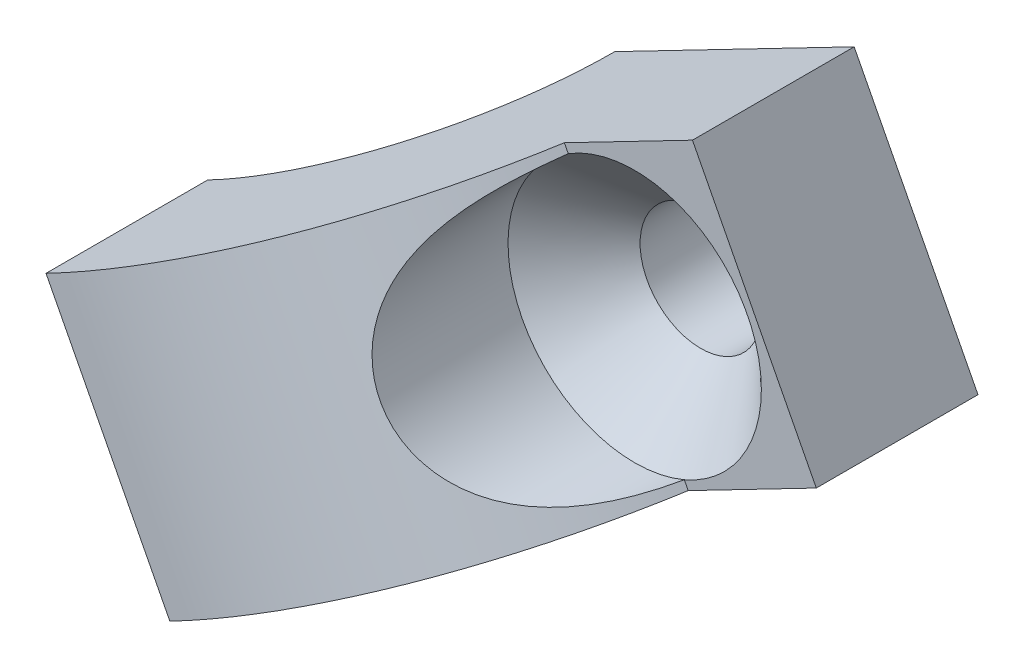
ISO-10303-21;
HEADER;
FILE_DESCRIPTION(('STEP AP214'),'2;1');
FILE_NAME('part.step','',(''),(''),'','','');
FILE_SCHEMA(('AUTOMOTIVE_DESIGN { 1 0 10303 214 1 1 1 1 }'));
ENDSEC;
DATA;
#1=APPLICATION_CONTEXT('core data for automotive mechanical design processes');
#2=APPLICATION_PROTOCOL_DEFINITION('international standard','automotive_design',2000,#1);
#3=PRODUCT_CONTEXT('',#1,'mechanical');
#4=PRODUCT('Part','Part','',(#3));
#5=PRODUCT_RELATED_PRODUCT_CATEGORY('part','',(#4));
#6=PRODUCT_DEFINITION_FORMATION('','',#4);
#7=PRODUCT_DEFINITION_CONTEXT('part definition',#1,'design');
#8=PRODUCT_DEFINITION('design','',#6,#7);
#9=PRODUCT_DEFINITION_SHAPE('','',#8);
#10=(LENGTH_UNIT() NAMED_UNIT(*) SI_UNIT(.MILLI.,.METRE.));
#11=(NAMED_UNIT(*) PLANE_ANGLE_UNIT() SI_UNIT($,.RADIAN.));
#12=(NAMED_UNIT(*) SI_UNIT($,.STERADIAN.) SOLID_ANGLE_UNIT());
#13=UNCERTAINTY_MEASURE_WITH_UNIT(LENGTH_MEASURE(1.E-05),#10,'distance_accuracy_value','');
#14=(GEOMETRIC_REPRESENTATION_CONTEXT(3) GLOBAL_UNCERTAINTY_ASSIGNED_CONTEXT((#13)) GLOBAL_UNIT_ASSIGNED_CONTEXT((#10,
#11,#12)) REPRESENTATION_CONTEXT('',''));
#15=CARTESIAN_POINT('',(0.,0.,0.));
#16=DIRECTION('',(0.,0.,1.));
#17=DIRECTION('',(1.,0.,0.));
#18=AXIS2_PLACEMENT_3D('',#15,#16,#17);
#19=CARTESIAN_POINT('',(-88.8437319794772,-54.5333247798695,27.9506255766667));
#20=DIRECTION('',(0.459545783688733,-0.888154081617547,0.));
#21=DIRECTION('',(0.888154081617547,0.459545783688733,0.));
#22=AXIS2_PLACEMENT_3D('',#19,#20,#21);
#23=CYLINDRICAL_SURFACE('',#22,14.);
#24=CARTESIAN_POINT('',(-73.1578062795977,-57.323924409204,33.9506255766667));
#25=CARTESIAN_POINT('',(-73.2135602395387,-57.3476724599156,34.0780271360485));
#26=CARTESIAN_POINT('',(-73.2716062671052,-57.3711348309346,34.204469152727));
#27=CARTESIAN_POINT('',(-73.3924399454088,-57.4170056057904,34.4553032040038));
#28=CARTESIAN_POINT('',(-73.4552288908372,-57.4394137191141,34.5796946674844));
#29=CARTESIAN_POINT('',(-73.6514285207596,-57.5044885696041,34.9504938764289));
#30=CARTESIAN_POINT('',(-73.7922215242245,-57.5448048916802,35.1934886847409));
#31=CARTESIAN_POINT('',(-74.0961207278185,-57.6149388973741,35.6714880758219));
#32=CARTESIAN_POINT('',(-74.2595034017159,-57.6446069348579,35.9063397924173));
#33=CARTESIAN_POINT('',(-74.6068896251844,-57.6867882175965,36.3614798057225));
#34=CARTESIAN_POINT('',(-74.7908497712302,-57.6993368607288,36.5817972540315));
#35=CARTESIAN_POINT('',(-75.085656588281,-57.7003074920455,36.9037548556136));
#36=CARTESIAN_POINT('',(-75.1894973929733,-57.6973856479032,37.0118533680927));
#37=CARTESIAN_POINT('',(-75.4020763418752,-57.683981017815,37.2226869017059));
#38=CARTESIAN_POINT('',(-75.5108146309852,-57.673498008021,37.3254217639528));
#39=CARTESIAN_POINT('',(-75.7321448813478,-57.6439615090948,37.5245030997131));
#40=CARTESIAN_POINT('',(-75.8447205520374,-57.6249408803691,37.6208724571251));
#41=CARTESIAN_POINT('',(-76.0732855444778,-57.5773008364498,37.8069983374078));
#42=CARTESIAN_POINT('',(-76.1892748150608,-57.5486815650672,37.8967549593288));
#43=CARTESIAN_POINT('',(-76.4251144779565,-57.4804363905553,38.0701097686517));
#44=CARTESIAN_POINT('',(-76.5449955079169,-57.4406716845336,38.1536122693272));
#45=CARTESIAN_POINT('',(-76.7857232072597,-57.349454187552,38.3124376740574));
#46=CARTESIAN_POINT('',(-76.9065696795239,-57.2980037265053,38.3877622042221));
#47=CARTESIAN_POINT('',(-77.1476035059059,-57.1827792433736,38.5296118392848));
#48=CARTESIAN_POINT('',(-77.2677907816245,-57.1190037867955,38.5961359183879));
#49=CARTESIAN_POINT('',(-77.5056042006024,-56.97881692934,38.71979084358));
#50=CARTESIAN_POINT('',(-77.6232309144309,-56.9024083767937,38.7769238012683));
#51=CARTESIAN_POINT('',(-77.8370713870962,-56.7490963930384,38.8737035525514));
#52=CARTESIAN_POINT('',(-77.9339039069313,-56.6738942903819,38.9146854923472));
#53=CARTESIAN_POINT('',(-78.1229790199715,-56.5145804583218,38.9892315194929));
#54=CARTESIAN_POINT('',(-78.2152224232026,-56.4304703095389,39.0227969195634));
#55=CARTESIAN_POINT('',(-78.3938394849096,-56.2538621701295,39.0823220049869));
#56=CARTESIAN_POINT('',(-78.4802168045268,-56.1613694969515,39.1082864683731));
#57=CARTESIAN_POINT('',(-78.6460089593225,-55.9686310221539,39.1525153550461));
#58=CARTESIAN_POINT('',(-78.7254246528427,-55.8683861792236,39.1707807286618));
#59=CARTESIAN_POINT('',(-78.8657867918916,-55.675423268883,39.197540068034));
#60=CARTESIAN_POINT('',(-78.9277666582483,-55.5835924977365,39.2070385887484));
#61=CARTESIAN_POINT('',(-79.0452412107903,-55.3954782509973,39.2202455221582));
#62=CARTESIAN_POINT('',(-79.1007364507407,-55.2991951565994,39.2239544296017));
#63=CARTESIAN_POINT('',(-79.2047576712576,-55.1029369847884,39.225572048529));
#64=CARTESIAN_POINT('',(-79.2532862991718,-55.0029633280604,39.223482969446));
#65=CARTESIAN_POINT('',(-79.3430459910153,-54.8000711388732,39.2135151732615));
#66=CARTESIAN_POINT('',(-79.3842770531613,-54.6971526056944,39.2056364547453));
#67=CARTESIAN_POINT('',(-79.4576968843154,-54.4933828460244,39.1845451211102));
#68=CARTESIAN_POINT('',(-79.4901824634142,-54.3926147702895,39.1715595994419));
#69=CARTESIAN_POINT('',(-79.5481187918902,-54.1898473145003,39.140307345525));
#70=CARTESIAN_POINT('',(-79.5735672407711,-54.0878475431405,39.1220388902247));
#71=CARTESIAN_POINT('',(-79.617405815662,-53.8834500695527,39.0802864911729));
#72=CARTESIAN_POINT('',(-79.6357989346844,-53.7810525547191,39.0568047656844));
#73=CARTESIAN_POINT('',(-79.6656520278747,-53.5765224871061,39.004690438722));
#74=CARTESIAN_POINT('',(-79.6771094037437,-53.4743900478798,38.9760559120877));
#75=CARTESIAN_POINT('',(-79.6934731908901,-53.268703190007,38.912994860817));
#76=CARTESIAN_POINT('',(-79.6982163890116,-53.165173174144,38.8784462011189));
#77=CARTESIAN_POINT('',(-79.7009518563425,-52.9598720512146,38.8041989274549));
#78=CARTESIAN_POINT('',(-79.6989416877101,-52.8581015926439,38.7644984587528));
#79=CARTESIAN_POINT('',(-79.6833446548942,-52.5564610182486,38.6379138322664));
#80=CARTESIAN_POINT('',(-79.6602007298819,-52.3601298177295,38.5435061702367));
#81=CARTESIAN_POINT('',(-79.5893090779863,-51.9644949200524,38.327129031997));
#82=CARTESIAN_POINT('',(-79.5395358141487,-51.7665118607047,38.203444387542));
#83=CARTESIAN_POINT('',(-79.4202408365403,-51.3905315147944,37.9369689512831));
#84=CARTESIAN_POINT('',(-79.3507195986424,-51.2125337467845,37.7941786199185));
#85=CARTESIAN_POINT('',(-79.2157987768513,-50.9175006084865,37.5279876549599));
#86=CARTESIAN_POINT('',(-79.1533069759273,-50.7959986663452,37.4079780242692));
#87=CARTESIAN_POINT('',(-79.0224381566121,-50.565338645716,37.1595052282328));
#88=CARTESIAN_POINT('',(-78.9540584362902,-50.4561862881159,37.0310381882681));
#89=CARTESIAN_POINT('',(-78.8131572119887,-50.2494429742986,36.7661450709101));
#90=CARTESIAN_POINT('',(-78.7406174183743,-50.1519099717619,36.6296837798473));
#91=CARTESIAN_POINT('',(-78.5934545299068,-49.9683460999754,36.3502864391111));
#92=CARTESIAN_POINT('',(-78.5188309250626,-49.882318076808,36.2073487989941));
#93=CARTESIAN_POINT('',(-78.3590553034694,-49.7102724039257,35.8964750520034));
#94=CARTESIAN_POINT('',(-78.2738221967583,-49.625775848912,35.7277414163063));
#95=CARTESIAN_POINT('',(-78.1043927757407,-49.4692713077764,35.3840202069455));
#96=CARTESIAN_POINT('',(-78.020196894348,-49.3972683823981,35.2090301334657));
#97=CARTESIAN_POINT('',(-77.8553791099386,-49.2653200930206,34.8559207716682));
#98=CARTESIAN_POINT('',(-77.7747257241218,-49.205235513263,34.6778677555682));
#99=CARTESIAN_POINT('',(-77.6170963541748,-49.0948778088556,34.3173994726159));
#100=CARTESIAN_POINT('',(-77.5401163544238,-49.0445937759973,34.1349893122506));
#101=CARTESIAN_POINT('',(-77.4654813537778,-48.9985750420414,33.9506255766668));
#102=B_SPLINE_CURVE_WITH_KNOTS('',3,(#24,#25,#26,#27,#28,#29,#30,#31,#32,#33,#34,#35,#36,#37,
#38,#39,#40,#41,#42,#43,#44,#45,#46,#47,#48,#49,#50,#51,#52,#53,#54,#55,#56,#57,#58,#59,#60,#61,
#62,#63,#64,#65,#66,#67,#68,#69,#70,#71,#72,#73,#74,#75,#76,#77,#78,#79,#80,#81,#82,#83,#84,#85,
#86,#87,#88,#89,#90,#91,#92,#93,#94,#95,#96,#97,#98,#99,#100,#101),.UNSPECIFIED.,.F.,.F.,(4,2,2,
2,2,2,2,2,2,2,2,2,2,2,2,2,2,2,2,2,2,2,2,2,2,2,2,2,2,2,2,2,2,2,2,2,2,2,4),(0.,0.423195212599889,
0.84650636671774,1.69656664790161,2.55814432224936,3.41793779315506,3.86740222850686,
4.31687997078522,4.76464236023326,5.21239804140911,5.66599869222485,6.11950898313133,
6.57307208944386,7.02653307189454,7.41378176107833,7.80096185260966,8.18789803323298,
8.57478643881442,8.90796041086726,9.24110591016703,9.57412447546414,9.90714312214067,
10.2267778523459,10.5465169506046,10.8661202587179,11.1858432240617,11.513212096257,
11.8406991553245,12.4952631566718,13.208695023705,13.9221097004126,14.4669488469125,
15.0120393630651,15.5597438963675,16.1075836702449,16.7282374289688,17.3491420094339,
17.9623006128006,18.5747728112573),.UNSPECIFIED.);
#103=CARTESIAN_POINT('',(-73.1578062795971,-57.3239244092051,33.9506255766667));
#104=VERTEX_POINT('',#103);
#105=CARTESIAN_POINT('',(-77.4654813537777,-48.9985750420417,33.9506255766667));
#106=VERTEX_POINT('',#105);
#107=EDGE_CURVE('E49',#104,#106,#102,.T.);
#108=ORIENTED_EDGE('',*,*,#107,.T.);
#109=DIRECTION('',(0.459545783688733,-0.888154081617547,0.));
#110=VECTOR('',#109,1.);
#111=CARTESIAN_POINT('',(-77.6093727351311,-48.7204793175357,33.9506255766667));
#112=LINE('',#111,#110);
#113=CARTESIAN_POINT('',(-77.6093727351311,-48.7204793175357,33.9506255766667));
#114=VERTEX_POINT('',#113);
#115=EDGE_CURVE('E146',#114,#106,#112,.T.);
#116=ORIENTED_EDGE('',*,*,#115,.F.);
#117=CARTESIAN_POINT('',(-88.8437319794772,-54.5333247798695,27.9506255766667));
#118=DIRECTION('',(-0.459545783688733,0.888154081617547,0.));
#119=DIRECTION('',(-0.888154081617547,-0.459545783688733,0.));
#120=AXIS2_PLACEMENT_3D('',#117,#118,#119);
#121=CIRCLE('',#120,14.);
#122=CARTESIAN_POINT('',(-88.8437319794772,-54.5333247798695,41.9506255766667));
#123=VERTEX_POINT('',#122);
#124=EDGE_CURVE('E108',#123,#114,#121,.T.);
#125=ORIENTED_EDGE('',*,*,#124,.F.);
#126=DIRECTION('',(0.459545783688733,-0.888154081617547,0.));
#127=VECTOR('',#126,1.);
#128=CARTESIAN_POINT('',(-88.8437319794772,-54.5333247798695,41.9506255766667));
#129=LINE('',#128,#127);
#130=CARTESIAN_POINT('',(-84.2482741425898,-63.4148655960449,41.9506255766667));
#131=VERTEX_POINT('',#130);
#132=EDGE_CURVE('E43',#123,#131,#129,.T.);
#133=ORIENTED_EDGE('',*,*,#132,.T.);
#134=CARTESIAN_POINT('',(-84.2482741425898,-63.4148655960449,27.9506255766667));
#135=DIRECTION('',(-0.459545783688733,0.888154081617547,0.));
#136=DIRECTION('',(-0.888154081617547,-0.459545783688733,0.));
#137=AXIS2_PLACEMENT_3D('',#134,#135,#136);
#138=CIRCLE('',#137,14.);
#139=CARTESIAN_POINT('',(-73.0139148982437,-57.6020201337111,33.9506255766667));
#140=VERTEX_POINT('',#139);
#141=EDGE_CURVE('E136',#131,#140,#138,.T.);
#142=ORIENTED_EDGE('',*,*,#141,.T.);
#143=EDGE_CURVE('E121',#104,#140,#112,.T.);
#144=ORIENTED_EDGE('',*,*,#143,.F.);
#145=EDGE_LOOP('',(#108,#116,#125,#133,#142,#144));
#146=FACE_BOUND('',#145,.T.);
#147=ADVANCED_FACE('F35',(#146),#23,.T.);
#148=CARTESIAN_POINT('',(-72.8569585103614,-46.2615006734723,33.9506255766667));
#149=DIRECTION('',(0.,0.,-1.));
#150=DIRECTION('',(-1.,0.,0.));
#151=AXIS2_PLACEMENT_3D('',#148,#149,#150);
#152=PLANE('',#151);
#153=CARTESIAN_POINT('',(-75.0000000000054,-53.0000000000037,33.9506255766667));
#154=DIRECTION('',(0.,0.,1.));
#155=DIRECTION('',(1.,0.,0.));
#156=AXIS2_PLACEMENT_3D('',#153,#154,#155);
#157=CIRCLE('',#156,4.7);
#158=EDGE_CURVE('E162',#104,#106,#157,.T.);
#159=ORIENTED_EDGE('',*,*,#158,.F.);
#160=ORIENTED_EDGE('',*,*,#143,.T.);
#161=DIRECTION('',(0.888154081617547,0.459545783688734,0.));
#162=VECTOR('',#161,1.);
#163=CARTESIAN_POINT('',(-68.261500673474,-55.1430414896477,33.9506255766667));
#164=LINE('',#163,#162);
#165=CARTESIAN_POINT('',(-68.261500673474,-55.1430414896477,33.9506255766667));
#166=VERTEX_POINT('',#165);
#167=EDGE_CURVE('E118',#140,#166,#164,.T.);
#168=ORIENTED_EDGE('',*,*,#167,.T.);
#169=DIRECTION('',(0.459545783688733,-0.888154081617547,0.));
#170=VECTOR('',#169,1.);
#171=CARTESIAN_POINT('',(-72.8569585103614,-46.2615006734723,33.9506255766667));
#172=LINE('',#171,#170);
#173=CARTESIAN_POINT('',(-72.8569585103614,-46.2615006734723,33.9506255766667));
#174=VERTEX_POINT('',#173);
#175=EDGE_CURVE('E114',#174,#166,#172,.T.);
#176=ORIENTED_EDGE('',*,*,#175,.F.);
#177=DIRECTION('',(0.888154081617547,0.459545783688734,0.));
#178=VECTOR('',#177,1.);
#179=CARTESIAN_POINT('',(-72.8569585103614,-46.2615006734723,33.9506255766667));
#180=LINE('',#179,#178);
#181=EDGE_CURVE('E101',#114,#174,#180,.T.);
#182=ORIENTED_EDGE('',*,*,#181,.F.);
#183=ORIENTED_EDGE('',*,*,#115,.T.);
#184=EDGE_LOOP('',(#159,#160,#168,#176,#182,#183));
#185=FACE_BOUND('',#184,.T.);
#186=ADVANCED_FACE('F116',(#185),#152,.F.);
#187=CARTESIAN_POINT('',(-88.8437319794772,-54.5333247798695,27.9506255766667));
#188=DIRECTION('',(0.459545783688733,-0.888154081617547,0.));
#189=DIRECTION('',(0.888154081617547,0.459545783688733,0.));
#190=AXIS2_PLACEMENT_3D('',#187,#188,#189);
#191=CYLINDRICAL_SURFACE('',#190,8.);
#192=CARTESIAN_POINT('',(-84.2482741425898,-63.4148655960449,27.9506255766667));
#193=DIRECTION('',(0.459545783688733,-0.888154081617547,0.));
#194=DIRECTION('',(-0.888154081617547,-0.459545783688733,0.));
#195=AXIS2_PLACEMENT_3D('',#192,#193,#194);
#196=CIRCLE('',#195,8.);
#197=CARTESIAN_POINT('',(-77.1430414896495,-59.7384993265351,27.9506255766667));
#198=VERTEX_POINT('',#197);
#199=CARTESIAN_POINT('',(-84.2482741425898,-63.4148655960449,35.9506255766667));
#200=VERTEX_POINT('',#199);
#201=EDGE_CURVE('E130',#198,#200,#196,.T.);
#202=ORIENTED_EDGE('',*,*,#201,.T.);
#203=DIRECTION('',(0.459545783688733,-0.888154081617547,0.));
#204=VECTOR('',#203,1.);
#205=CARTESIAN_POINT('',(-88.8437319794772,-54.5333247798695,35.9506255766667));
#206=LINE('',#205,#204);
#207=CARTESIAN_POINT('',(-88.8437319794772,-54.5333247798695,35.9506255766667));
#208=VERTEX_POINT('',#207);
#209=EDGE_CURVE('E11',#208,#200,#206,.T.);
#210=ORIENTED_EDGE('',*,*,#209,.F.);
#211=CARTESIAN_POINT('',(-88.8437319794772,-54.5333247798695,27.9506255766667));
#212=DIRECTION('',(0.459545783688733,-0.888154081617547,0.));
#213=DIRECTION('',(-0.888154081617547,-0.459545783688733,0.));
#214=AXIS2_PLACEMENT_3D('',#211,#212,#213);
#215=CIRCLE('',#214,8.);
#216=CARTESIAN_POINT('',(-81.7384993265368,-50.8569585103596,27.9506255766667));
#217=VERTEX_POINT('',#216);
#218=EDGE_CURVE('E143',#217,#208,#215,.T.);
#219=ORIENTED_EDGE('',*,*,#218,.F.);
#220=DIRECTION('',(0.459545783688733,-0.888154081617547,0.));
#221=VECTOR('',#220,1.);
#222=CARTESIAN_POINT('',(-81.7384993265368,-50.8569585103596,27.9506255766667));
#223=LINE('',#222,#221);
#224=EDGE_CURVE('E126',#217,#198,#223,.T.);
#225=ORIENTED_EDGE('',*,*,#224,.T.);
#226=EDGE_LOOP('',(#202,#210,#219,#225));
#227=FACE_BOUND('',#226,.T.);
#228=ADVANCED_FACE('F37',(#227),#191,.F.);
#229=CARTESIAN_POINT('',(-88.8437319794772,-54.5333247798695,35.9506255766667));
#230=DIRECTION('',(0.888154081617547,0.459545783688733,0.));
#231=DIRECTION('',(-0.459545783688733,0.888154081617547,0.));
#232=AXIS2_PLACEMENT_3D('',#229,#230,#231);
#233=PLANE('',#232);
#234=DIRECTION('',(0.,0.,1.));
#235=VECTOR('',#234,1.);
#236=CARTESIAN_POINT('',(-84.2482741425898,-63.4148655960449,35.9506255766667));
#237=LINE('',#236,#235);
#238=EDGE_CURVE('E133',#200,#131,#237,.T.);
#239=ORIENTED_EDGE('',*,*,#238,.T.);
#240=ORIENTED_EDGE('',*,*,#132,.F.);
#241=DIRECTION('',(0.,0.,1.));
#242=VECTOR('',#241,1.);
#243=CARTESIAN_POINT('',(-88.8437319794772,-54.5333247798695,35.9506255766667));
#244=LINE('',#243,#242);
#245=EDGE_CURVE('E93',#208,#123,#244,.T.);
#246=ORIENTED_EDGE('',*,*,#245,.F.);
#247=ORIENTED_EDGE('',*,*,#209,.T.);
#248=EDGE_LOOP('',(#239,#240,#246,#247));
#249=FACE_BOUND('',#248,.T.);
#250=ADVANCED_FACE('F197',(#249),#233,.F.);
#251=CARTESIAN_POINT('',(-72.8569585103614,-46.2615006734723,27.9506255766667));
#252=DIRECTION('',(-0.888154081617547,-0.459545783688733,0.));
#253=DIRECTION('',(0.459545783688733,-0.888154081617547,0.));
#254=AXIS2_PLACEMENT_3D('',#251,#252,#253);
#255=PLANE('',#254);
#256=DIRECTION('',(0.,0.,-1.));
#257=VECTOR('',#256,1.);
#258=CARTESIAN_POINT('',(-68.261500673474,-55.1430414896477,27.9506255766667));
#259=LINE('',#258,#257);
#260=CARTESIAN_POINT('',(-68.261500673474,-55.1430414896477,27.9506255766667));
#261=VERTEX_POINT('',#260);
#262=EDGE_CURVE('E140',#166,#261,#259,.T.);
#263=ORIENTED_EDGE('',*,*,#262,.T.);
#264=DIRECTION('',(0.459545783688733,-0.888154081617547,0.));
#265=VECTOR('',#264,1.);
#266=CARTESIAN_POINT('',(-72.8569585103614,-46.2615006734723,27.9506255766667));
#267=LINE('',#266,#265);
#268=CARTESIAN_POINT('',(-72.8569585103614,-46.2615006734723,27.9506255766667));
#269=VERTEX_POINT('',#268);
#270=EDGE_CURVE('E122',#269,#261,#267,.T.);
#271=ORIENTED_EDGE('',*,*,#270,.F.);
#272=DIRECTION('',(0.,0.,-1.));
#273=VECTOR('',#272,1.);
#274=CARTESIAN_POINT('',(-72.8569585103614,-46.2615006734723,27.9506255766667));
#275=LINE('',#274,#273);
#276=EDGE_CURVE('E105',#174,#269,#275,.T.);
#277=ORIENTED_EDGE('',*,*,#276,.F.);
#278=ORIENTED_EDGE('',*,*,#175,.T.);
#279=EDGE_LOOP('',(#263,#271,#277,#278));
#280=FACE_BOUND('',#279,.T.);
#281=ADVANCED_FACE('F124',(#280),#255,.F.);
#282=CARTESIAN_POINT('',(-81.7384993265368,-50.8569585103596,27.9506255766667));
#283=DIRECTION('',(0.,0.,1.));
#284=DIRECTION('',(1.,0.,0.));
#285=AXIS2_PLACEMENT_3D('',#282,#283,#284);
#286=PLANE('',#285);
#287=CARTESIAN_POINT('',(-75.0000000000054,-53.0000000000037,27.9506255766667));
#288=DIRECTION('',(0.,0.,1.));
#289=DIRECTION('',(1.,0.,0.));
#290=AXIS2_PLACEMENT_3D('',#287,#288,#289);
#291=CIRCLE('',#290,2.25);
#292=CARTESIAN_POINT('',(-72.7500000000054,-53.0000000000037,27.9506255766667));
#293=VERTEX_POINT('',#292);
#294=EDGE_CURVE('E166',#293,#293,#291,.T.);
#295=ORIENTED_EDGE('',*,*,#294,.T.);
#296=EDGE_LOOP('',(#295));
#297=FACE_BOUND('',#296,.T.);
#298=DIRECTION('',(-0.888154081617547,-0.459545783688733,0.));
#299=VECTOR('',#298,1.);
#300=CARTESIAN_POINT('',(-77.1430414896495,-59.7384993265351,27.9506255766667));
#301=LINE('',#300,#299);
#302=EDGE_CURVE('E85',#261,#198,#301,.T.);
#303=ORIENTED_EDGE('',*,*,#302,.T.);
#304=ORIENTED_EDGE('',*,*,#224,.F.);
#305=DIRECTION('',(-0.888154081617547,-0.459545783688733,0.));
#306=VECTOR('',#305,1.);
#307=CARTESIAN_POINT('',(-81.7384993265368,-50.8569585103596,27.9506255766667));
#308=LINE('',#307,#306);
#309=EDGE_CURVE('E58',#269,#217,#308,.T.);
#310=ORIENTED_EDGE('',*,*,#309,.F.);
#311=ORIENTED_EDGE('',*,*,#270,.T.);
#312=EDGE_LOOP('',(#303,#304,#310,#311));
#313=FACE_BOUND('',#312,.T.);
#314=ADVANCED_FACE('F154',(#297,#313),#286,.F.);
#315=CARTESIAN_POINT('',(-88.8437319794772,-54.5333247798695,27.9506255766667));
#316=DIRECTION('',(-0.459545783688733,0.888154081617547,0.));
#317=DIRECTION('',(-0.888154081617547,-0.459545783688733,0.));
#318=AXIS2_PLACEMENT_3D('',#315,#316,#317);
#319=PLANE('',#318);
#320=ORIENTED_EDGE('',*,*,#218,.T.);
#321=ORIENTED_EDGE('',*,*,#245,.T.);
#322=ORIENTED_EDGE('',*,*,#124,.T.);
#323=ORIENTED_EDGE('',*,*,#181,.T.);
#324=ORIENTED_EDGE('',*,*,#276,.T.);
#325=ORIENTED_EDGE('',*,*,#309,.T.);
#326=EDGE_LOOP('',(#320,#321,#322,#323,#324,#325));
#327=FACE_BOUND('',#326,.T.);
#328=ADVANCED_FACE('F103',(#327),#319,.T.);
#329=CARTESIAN_POINT('',(-84.2482741425898,-63.4148655960449,27.9506255766667));
#330=DIRECTION('',(-0.459545783688733,0.888154081617547,0.));
#331=DIRECTION('',(-0.888154081617547,-0.459545783688733,0.));
#332=AXIS2_PLACEMENT_3D('',#329,#330,#331);
#333=PLANE('',#332);
#334=ORIENTED_EDGE('',*,*,#201,.F.);
#335=ORIENTED_EDGE('',*,*,#302,.F.);
#336=ORIENTED_EDGE('',*,*,#262,.F.);
#337=ORIENTED_EDGE('',*,*,#167,.F.);
#338=ORIENTED_EDGE('',*,*,#141,.F.);
#339=ORIENTED_EDGE('',*,*,#238,.F.);
#340=EDGE_LOOP('',(#334,#335,#336,#337,#338,#339));
#341=FACE_BOUND('',#340,.T.);
#342=ADVANCED_FACE('F153',(#341),#333,.F.);
#343=CARTESIAN_POINT('',(-75.0000000000054,-53.0000000000037,33.9506255766667));
#344=DIRECTION('',(0.,0.,1.));
#345=DIRECTION('',(1.,0.,0.));
#346=AXIS2_PLACEMENT_3D('',#343,#344,#345);
#347=CONICAL_SURFACE('',#346,4.7,0.785398163397447);
#348=CARTESIAN_POINT('',(-75.0000000000054,-53.0000000000037,31.5006255766667));
#349=DIRECTION('',(0.,0.,1.));
#350=DIRECTION('',(1.,0.,0.));
#351=AXIS2_PLACEMENT_3D('',#348,#349,#350);
#352=CIRCLE('',#351,2.25);
#353=CARTESIAN_POINT('',(-72.7500000000054,-53.0000000000037,31.5006255766667));
#354=VERTEX_POINT('',#353);
#355=EDGE_CURVE('E163',#354,#354,#352,.T.);
#356=ORIENTED_EDGE('',*,*,#355,.F.);
#357=EDGE_LOOP('',(#356));
#358=FACE_BOUND('',#357,.T.);
#359=EDGE_CURVE('E134',#106,#104,#157,.T.);
#360=ORIENTED_EDGE('',*,*,#359,.T.);
#361=ORIENTED_EDGE('',*,*,#158,.T.);
#362=EDGE_LOOP('',(#360,#361));
#363=FACE_BOUND('',#362,.T.);
#364=ADVANCED_FACE('F183',(#358,#363),#347,.F.);
#365=CARTESIAN_POINT('',(-75.0000000000054,-53.0000000000037,33.9506255766667));
#366=DIRECTION('',(0.,0.,1.));
#367=DIRECTION('',(1.,0.,0.));
#368=AXIS2_PLACEMENT_3D('',#365,#366,#367);
#369=CYLINDRICAL_SURFACE('',#368,2.25);
#370=ORIENTED_EDGE('',*,*,#294,.F.);
#371=EDGE_LOOP('',(#370));
#372=FACE_BOUND('',#371,.T.);
#373=ORIENTED_EDGE('',*,*,#355,.T.);
#374=EDGE_LOOP('',(#373));
#375=FACE_BOUND('',#374,.T.);
#376=ADVANCED_FACE('F180',(#372,#375),#369,.F.);
#377=CARTESIAN_POINT('',(-75.,-53.,41.9516255766667));
#378=DIRECTION('',(0.,0.,-1.));
#379=DIRECTION('',(-1.,0.,0.));
#380=AXIS2_PLACEMENT_3D('',#377,#378,#379);
#381=CYLINDRICAL_SURFACE('',#380,4.69999999999999);
#382=ORIENTED_EDGE('',*,*,#359,.F.);
#383=ORIENTED_EDGE('',*,*,#107,.F.);
#384=EDGE_LOOP('',(#382,#383));
#385=FACE_BOUND('',#384,.T.);
#386=ADVANCED_FACE('F175',(#385),#381,.F.);
#387=CLOSED_SHELL('',(#147,#186,#228,#250,#281,#314,#328,#342,#364,#376,#386));
#388=MANIFOLD_SOLID_BREP('B2',#387);
#389=ADVANCED_BREP_SHAPE_REPRESENTATION('',(#18,#388),#14);
#390=SHAPE_DEFINITION_REPRESENTATION(#9,#389);
ENDSEC;
END-ISO-10303-21;
